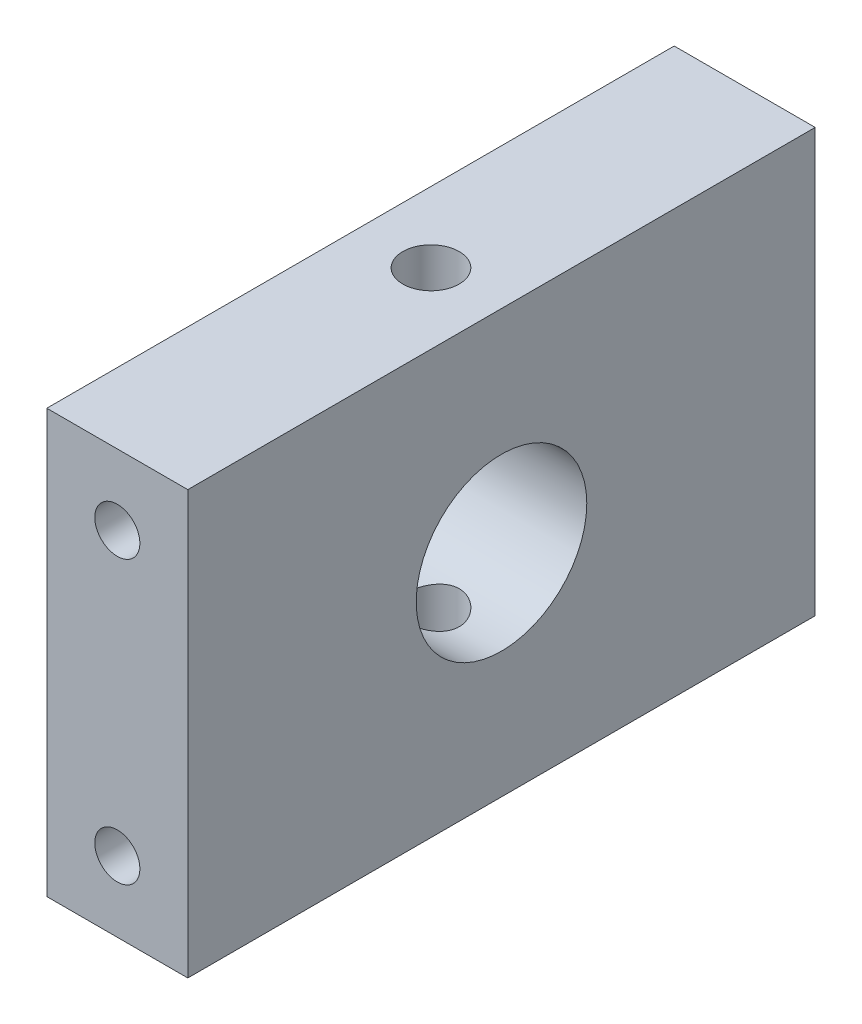
ISO-10303-21;
HEADER;
FILE_DESCRIPTION(('STEP AP214'),'2;1');
FILE_NAME('part.step','',(''),(''),'','','');
FILE_SCHEMA(('AUTOMOTIVE_DESIGN { 1 0 10303 214 1 1 1 1 }'));
ENDSEC;
DATA;
#1=APPLICATION_CONTEXT('core data for automotive mechanical design processes');
#2=APPLICATION_PROTOCOL_DEFINITION('international standard','automotive_design',2000,#1);
#3=PRODUCT_CONTEXT('',#1,'mechanical');
#4=PRODUCT('Part','Part','',(#3));
#5=PRODUCT_RELATED_PRODUCT_CATEGORY('part','',(#4));
#6=PRODUCT_DEFINITION_FORMATION('','',#4);
#7=PRODUCT_DEFINITION_CONTEXT('part definition',#1,'design');
#8=PRODUCT_DEFINITION('design','',#6,#7);
#9=PRODUCT_DEFINITION_SHAPE('','',#8);
#10=(LENGTH_UNIT() NAMED_UNIT(*) SI_UNIT(.MILLI.,.METRE.));
#11=(NAMED_UNIT(*) PLANE_ANGLE_UNIT() SI_UNIT($,.RADIAN.));
#12=(NAMED_UNIT(*) SI_UNIT($,.STERADIAN.) SOLID_ANGLE_UNIT());
#13=UNCERTAINTY_MEASURE_WITH_UNIT(LENGTH_MEASURE(1.E-05),#10,'distance_accuracy_value','');
#14=(GEOMETRIC_REPRESENTATION_CONTEXT(3) GLOBAL_UNCERTAINTY_ASSIGNED_CONTEXT((#13)) GLOBAL_UNIT_ASSIGNED_CONTEXT((#10,
#11,#12)) REPRESENTATION_CONTEXT('',''));
#15=CARTESIAN_POINT('',(0.,0.,0.));
#16=DIRECTION('',(0.,0.,1.));
#17=DIRECTION('',(1.,0.,0.));
#18=AXIS2_PLACEMENT_3D('',#15,#16,#17);
#19=CARTESIAN_POINT('',(10.,0.,0.));
#20=DIRECTION('',(1.,0.,0.));
#21=DIRECTION('',(0.,0.,-1.));
#22=AXIS2_PLACEMENT_3D('',#19,#20,#21);
#23=PLANE('',#22);
#24=DIRECTION('',(0.,1.,0.));
#25=VECTOR('',#24,1.);
#26=CARTESIAN_POINT('',(10.,15.,-22.25));
#27=LINE('',#26,#25);
#28=CARTESIAN_POINT('',(10.,-15.,-22.25));
#29=VERTEX_POINT('',#28);
#30=CARTESIAN_POINT('',(10.,15.,-22.25));
#31=VERTEX_POINT('',#30);
#32=EDGE_CURVE('E94',#29,#31,#27,.T.);
#33=ORIENTED_EDGE('',*,*,#32,.T.);
#34=DIRECTION('',(0.,0.,1.));
#35=VECTOR('',#34,1.);
#36=CARTESIAN_POINT('',(10.,15.,22.25));
#37=LINE('',#36,#35);
#38=CARTESIAN_POINT('',(10.,15.,22.25));
#39=VERTEX_POINT('',#38);
#40=EDGE_CURVE('E89',#31,#39,#37,.T.);
#41=ORIENTED_EDGE('',*,*,#40,.T.);
#42=DIRECTION('',(0.,-1.,0.));
#43=VECTOR('',#42,1.);
#44=CARTESIAN_POINT('',(10.,15.,22.25));
#45=LINE('',#44,#43);
#46=CARTESIAN_POINT('',(10.,-15.,22.25));
#47=VERTEX_POINT('',#46);
#48=EDGE_CURVE('E92',#39,#47,#45,.T.);
#49=ORIENTED_EDGE('',*,*,#48,.T.);
#50=DIRECTION('',(0.,0.,-1.));
#51=VECTOR('',#50,1.);
#52=CARTESIAN_POINT('',(10.,-15.,22.25));
#53=LINE('',#52,#51);
#54=EDGE_CURVE('E59',#47,#29,#53,.T.);
#55=ORIENTED_EDGE('',*,*,#54,.T.);
#56=EDGE_LOOP('',(#33,#41,#49,#55));
#57=FACE_BOUND('',#56,.T.);
#58=CARTESIAN_POINT('',(10.,0.,0.));
#59=DIRECTION('',(1.,0.,0.));
#60=DIRECTION('',(0.,0.,-1.));
#61=AXIS2_PLACEMENT_3D('',#58,#59,#60);
#62=CIRCLE('',#61,6.05);
#63=CARTESIAN_POINT('',(10.,0.,-6.05));
#64=VERTEX_POINT('',#63);
#65=EDGE_CURVE('E110',#64,#64,#62,.T.);
#66=ORIENTED_EDGE('',*,*,#65,.F.);
#67=EDGE_LOOP('',(#66));
#68=FACE_BOUND('',#67,.T.);
#69=ADVANCED_FACE('F35',(#57,#68),#23,.T.);
#70=CARTESIAN_POINT('',(0.,0.,0.));
#71=DIRECTION('',(1.,0.,0.));
#72=DIRECTION('',(0.,0.,-1.));
#73=AXIS2_PLACEMENT_3D('',#70,#71,#72);
#74=PLANE('',#73);
#75=DIRECTION('',(0.,1.,0.));
#76=VECTOR('',#75,1.);
#77=CARTESIAN_POINT('',(0.,15.,-22.25));
#78=LINE('',#77,#76);
#79=CARTESIAN_POINT('',(0.,-15.,-22.25));
#80=VERTEX_POINT('',#79);
#81=CARTESIAN_POINT('',(0.,15.,-22.25));
#82=VERTEX_POINT('',#81);
#83=EDGE_CURVE('E107',#80,#82,#78,.T.);
#84=ORIENTED_EDGE('',*,*,#83,.F.);
#85=DIRECTION('',(0.,0.,-1.));
#86=VECTOR('',#85,1.);
#87=CARTESIAN_POINT('',(0.,-15.,22.25));
#88=LINE('',#87,#86);
#89=CARTESIAN_POINT('',(0.,-15.,22.25));
#90=VERTEX_POINT('',#89);
#91=EDGE_CURVE('E82',#90,#80,#88,.T.);
#92=ORIENTED_EDGE('',*,*,#91,.F.);
#93=DIRECTION('',(0.,-1.,0.));
#94=VECTOR('',#93,1.);
#95=CARTESIAN_POINT('',(0.,15.,22.25));
#96=LINE('',#95,#94);
#97=CARTESIAN_POINT('',(0.,15.,22.25));
#98=VERTEX_POINT('',#97);
#99=EDGE_CURVE('E76',#98,#90,#96,.T.);
#100=ORIENTED_EDGE('',*,*,#99,.F.);
#101=DIRECTION('',(0.,0.,1.));
#102=VECTOR('',#101,1.);
#103=CARTESIAN_POINT('',(0.,15.,22.25));
#104=LINE('',#103,#102);
#105=EDGE_CURVE('E98',#82,#98,#104,.T.);
#106=ORIENTED_EDGE('',*,*,#105,.F.);
#107=EDGE_LOOP('',(#84,#92,#100,#106));
#108=FACE_BOUND('',#107,.T.);
#109=CARTESIAN_POINT('',(0.,0.,0.));
#110=DIRECTION('',(1.,0.,0.));
#111=DIRECTION('',(0.,0.,-1.));
#112=AXIS2_PLACEMENT_3D('',#109,#110,#111);
#113=CIRCLE('',#112,6.05);
#114=CARTESIAN_POINT('',(0.,0.,-6.05));
#115=VERTEX_POINT('',#114);
#116=EDGE_CURVE('E191',#115,#115,#113,.T.);
#117=ORIENTED_EDGE('',*,*,#116,.T.);
#118=EDGE_LOOP('',(#117));
#119=FACE_BOUND('',#118,.T.);
#120=ADVANCED_FACE('F157',(#108,#119),#74,.F.);
#121=CARTESIAN_POINT('',(10.,15.,-22.25));
#122=DIRECTION('',(0.,0.,1.));
#123=DIRECTION('',(0.,-1.,0.));
#124=AXIS2_PLACEMENT_3D('',#121,#122,#123);
#125=PLANE('',#124);
#126=CARTESIAN_POINT('',(5.,10.,-22.25));
#127=DIRECTION('',(0.,0.,1.));
#128=DIRECTION('',(1.,0.,0.));
#129=AXIS2_PLACEMENT_3D('',#126,#127,#128);
#130=CIRCLE('',#129,1.6);
#131=CARTESIAN_POINT('',(6.6,10.,-22.25));
#132=VERTEX_POINT('',#131);
#133=EDGE_CURVE('E184',#132,#132,#130,.T.);
#134=ORIENTED_EDGE('',*,*,#133,.T.);
#135=EDGE_LOOP('',(#134));
#136=FACE_BOUND('',#135,.T.);
#137=CARTESIAN_POINT('',(5.,-10.,-22.25));
#138=DIRECTION('',(0.,0.,1.));
#139=DIRECTION('',(-1.,0.,0.));
#140=AXIS2_PLACEMENT_3D('',#137,#138,#139);
#141=CIRCLE('',#140,1.6);
#142=CARTESIAN_POINT('',(3.4,-10.,-22.25));
#143=VERTEX_POINT('',#142);
#144=EDGE_CURVE('E234',#143,#143,#141,.T.);
#145=ORIENTED_EDGE('',*,*,#144,.T.);
#146=EDGE_LOOP('',(#145));
#147=FACE_BOUND('',#146,.T.);
#148=ORIENTED_EDGE('',*,*,#83,.T.);
#149=DIRECTION('',(-1.,0.,0.));
#150=VECTOR('',#149,1.);
#151=CARTESIAN_POINT('',(10.,15.,-22.25));
#152=LINE('',#151,#150);
#153=EDGE_CURVE('E11',#31,#82,#152,.T.);
#154=ORIENTED_EDGE('',*,*,#153,.F.);
#155=ORIENTED_EDGE('',*,*,#32,.F.);
#156=DIRECTION('',(-1.,0.,0.));
#157=VECTOR('',#156,1.);
#158=CARTESIAN_POINT('',(10.,-15.,-22.25));
#159=LINE('',#158,#157);
#160=EDGE_CURVE('E103',#29,#80,#159,.T.);
#161=ORIENTED_EDGE('',*,*,#160,.T.);
#162=EDGE_LOOP('',(#148,#154,#155,#161));
#163=FACE_BOUND('',#162,.T.);
#164=ADVANCED_FACE('F37',(#136,#147,#163),#125,.F.);
#165=CARTESIAN_POINT('',(10.,15.,22.25));
#166=DIRECTION('',(0.,-1.,0.));
#167=DIRECTION('',(0.,0.,-1.));
#168=AXIS2_PLACEMENT_3D('',#165,#166,#167);
#169=PLANE('',#168);
#170=CARTESIAN_POINT('',(5.,15.,0.));
#171=DIRECTION('',(0.,1.,0.));
#172=DIRECTION('',(0.,0.,1.));
#173=AXIS2_PLACEMENT_3D('',#170,#171,#172);
#174=CIRCLE('',#173,2.);
#175=CARTESIAN_POINT('',(5.,15.,2.));
#176=VERTEX_POINT('',#175);
#177=EDGE_CURVE('E177',#176,#176,#174,.T.);
#178=ORIENTED_EDGE('',*,*,#177,.F.);
#179=EDGE_LOOP('',(#178));
#180=FACE_BOUND('',#179,.T.);
#181=ORIENTED_EDGE('',*,*,#105,.T.);
#182=DIRECTION('',(-1.,0.,0.));
#183=VECTOR('',#182,1.);
#184=CARTESIAN_POINT('',(10.,15.,22.25));
#185=LINE('',#184,#183);
#186=EDGE_CURVE('E50',#39,#98,#185,.T.);
#187=ORIENTED_EDGE('',*,*,#186,.F.);
#188=ORIENTED_EDGE('',*,*,#40,.F.);
#189=ORIENTED_EDGE('',*,*,#153,.T.);
#190=EDGE_LOOP('',(#181,#187,#188,#189));
#191=FACE_BOUND('',#190,.T.);
#192=ADVANCED_FACE('F97',(#180,#191),#169,.F.);
#193=CARTESIAN_POINT('',(10.,15.,22.25));
#194=DIRECTION('',(0.,0.,-1.));
#195=DIRECTION('',(0.,1.,0.));
#196=AXIS2_PLACEMENT_3D('',#193,#194,#195);
#197=PLANE('',#196);
#198=CARTESIAN_POINT('',(5.,10.,22.25));
#199=DIRECTION('',(0.,0.,1.));
#200=DIRECTION('',(1.,0.,0.));
#201=AXIS2_PLACEMENT_3D('',#198,#199,#200);
#202=CIRCLE('',#201,1.6);
#203=CARTESIAN_POINT('',(6.6,10.,22.25));
#204=VERTEX_POINT('',#203);
#205=EDGE_CURVE('E192',#204,#204,#202,.T.);
#206=ORIENTED_EDGE('',*,*,#205,.F.);
#207=EDGE_LOOP('',(#206));
#208=FACE_BOUND('',#207,.T.);
#209=CARTESIAN_POINT('',(5.,-10.,22.25));
#210=DIRECTION('',(0.,0.,1.));
#211=DIRECTION('',(-1.,0.,0.));
#212=AXIS2_PLACEMENT_3D('',#209,#210,#211);
#213=CIRCLE('',#212,1.6);
#214=CARTESIAN_POINT('',(3.4,-10.,22.25));
#215=VERTEX_POINT('',#214);
#216=EDGE_CURVE('E198',#215,#215,#213,.T.);
#217=ORIENTED_EDGE('',*,*,#216,.F.);
#218=EDGE_LOOP('',(#217));
#219=FACE_BOUND('',#218,.T.);
#220=ORIENTED_EDGE('',*,*,#99,.T.);
#221=DIRECTION('',(-1.,0.,0.));
#222=VECTOR('',#221,1.);
#223=CARTESIAN_POINT('',(10.,-15.,22.25));
#224=LINE('',#223,#222);
#225=EDGE_CURVE('E99',#47,#90,#224,.T.);
#226=ORIENTED_EDGE('',*,*,#225,.F.);
#227=ORIENTED_EDGE('',*,*,#48,.F.);
#228=ORIENTED_EDGE('',*,*,#186,.T.);
#229=EDGE_LOOP('',(#220,#226,#227,#228));
#230=FACE_BOUND('',#229,.T.);
#231=ADVANCED_FACE('F101',(#208,#219,#230),#197,.F.);
#232=CARTESIAN_POINT('',(10.,-15.,22.25));
#233=DIRECTION('',(0.,1.,0.));
#234=DIRECTION('',(0.,0.,1.));
#235=AXIS2_PLACEMENT_3D('',#232,#233,#234);
#236=PLANE('',#235);
#237=CARTESIAN_POINT('',(5.,-15.,0.));
#238=DIRECTION('',(0.,1.,0.));
#239=DIRECTION('',(0.,0.,1.));
#240=AXIS2_PLACEMENT_3D('',#237,#238,#239);
#241=CIRCLE('',#240,2.);
#242=CARTESIAN_POINT('',(5.,-15.,2.));
#243=VERTEX_POINT('',#242);
#244=EDGE_CURVE('E120',#243,#243,#241,.T.);
#245=ORIENTED_EDGE('',*,*,#244,.T.);
#246=EDGE_LOOP('',(#245));
#247=FACE_BOUND('',#246,.T.);
#248=ORIENTED_EDGE('',*,*,#91,.T.);
#249=ORIENTED_EDGE('',*,*,#160,.F.);
#250=ORIENTED_EDGE('',*,*,#54,.F.);
#251=ORIENTED_EDGE('',*,*,#225,.T.);
#252=EDGE_LOOP('',(#248,#249,#250,#251));
#253=FACE_BOUND('',#252,.T.);
#254=ADVANCED_FACE('F152',(#247,#253),#236,.F.);
#255=CARTESIAN_POINT('',(10.,0.,0.));
#256=DIRECTION('',(-1.,0.,0.));
#257=DIRECTION('',(0.,0.,1.));
#258=AXIS2_PLACEMENT_3D('',#255,#256,#257);
#259=CYLINDRICAL_SURFACE('',#258,6.05);
#260=CARTESIAN_POINT('',(5.,-5.70985989320229,2.));
#261=CARTESIAN_POINT('',(5.10899341399842,-5.70985969251801,2.00000033299551));
#262=CARTESIAN_POINT('',(5.21798517746904,-5.71301480876261,1.99106018764557));
#263=CARTESIAN_POINT('',(5.43274335025564,-5.72523014456364,1.95565393739282));
#264=CARTESIAN_POINT('',(5.53850918025653,-5.73429141829144,1.92918470376499));
#265=CARTESIAN_POINT('',(5.74367022766111,-5.75718298945268,1.85974865410086));
#266=CARTESIAN_POINT('',(5.84307733276571,-5.77100405988683,1.81681373909219));
#267=CARTESIAN_POINT('',(6.03330909579794,-5.80184459654205,1.71577369415444));
#268=CARTESIAN_POINT('',(6.12413190342937,-5.81886474995513,1.65766530377944));
#269=CARTESIAN_POINT('',(6.29811144742764,-5.85492013777094,1.52553295358191));
#270=CARTESIAN_POINT('',(6.38088968236369,-5.87400498740321,1.45102403554484));
#271=CARTESIAN_POINT('',(6.53303335790895,-5.91161962401294,1.28924100931994));
#272=CARTESIAN_POINT('',(6.60239668429235,-5.93014932310891,1.20196489278789));
#273=CARTESIAN_POINT('',(6.72745258924378,-5.96513938377732,1.01436352312949));
#274=CARTESIAN_POINT('',(6.78274950256297,-5.98153458529986,0.913761291745258));
#275=CARTESIAN_POINT('',(6.87548664755569,-6.00982445939949,0.704048423552746));
#276=CARTESIAN_POINT('',(6.91293160752153,-6.02172032350444,0.594940048611088));
#277=CARTESIAN_POINT('',(6.96762105046736,-6.03931977537713,0.375279847223151));
#278=CARTESIAN_POINT('',(6.98551373545209,-6.04522157358489,0.264905581909314));
#279=CARTESIAN_POINT('',(7.00265078238568,-6.0508710279118,0.042574144601172));
#280=CARTESIAN_POINT('',(7.00189987363358,-6.05062024474939,-0.0693826187609113));
#281=CARTESIAN_POINT('',(6.98218425956514,-6.04412760933234,-0.28711644888507));
#282=CARTESIAN_POINT('',(6.9639234236705,-6.03811728667631,-0.392965281514513));
#283=CARTESIAN_POINT('',(6.91086907465745,-6.02107078328729,-0.60000153330326));
#284=CARTESIAN_POINT('',(6.8760744459458,-6.01003426342116,-0.70118863741388));
#285=CARTESIAN_POINT('',(6.79052371378497,-5.98387844045024,-0.897579620221879));
#286=CARTESIAN_POINT('',(6.73956552572136,-5.96870780892522,-0.992688349802697));
#287=CARTESIAN_POINT('',(6.62330013260558,-5.93586549044274,-1.17321436451504));
#288=CARTESIAN_POINT('',(6.55798898419064,-5.91819311662703,-1.25862897646524));
#289=CARTESIAN_POINT('',(6.4113155686395,-5.88124585221435,-1.42153052077404));
#290=CARTESIAN_POINT('',(6.32934960760291,-5.86193465104437,-1.49846645322394));
#291=CARTESIAN_POINT('',(6.15351235331923,-5.8245790943231,-1.63767711547325));
#292=CARTESIAN_POINT('',(6.05963929081569,-5.80653492765866,-1.6999496625287));
#293=CARTESIAN_POINT('',(5.86093226336053,-5.773559796802,-1.80881182241094));
#294=CARTESIAN_POINT('',(5.75596476624013,-5.75867529539656,-1.85517284190742));
#295=CARTESIAN_POINT('',(5.53909783510901,-5.7342437035458,-1.92937638731519));
#296=CARTESIAN_POINT('',(5.42720126978115,-5.72469442047782,-1.95722652156643));
#297=CARTESIAN_POINT('',(5.20498195250766,-5.71250935220619,-1.99250389574057));
#298=CARTESIAN_POINT('',(5.09481038116964,-5.70958509251573,-2.00078401645862));
#299=CARTESIAN_POINT('',(4.87463603435479,-5.71017556693195,-1.99909929185839));
#300=CARTESIAN_POINT('',(4.76463323234498,-5.71368915608358,-1.98913769078416));
#301=CARTESIAN_POINT('',(4.55177035461893,-5.72647222201891,-1.95201810779321));
#302=CARTESIAN_POINT('',(4.44879447002954,-5.73554438328614,-1.92544902439455));
#303=CARTESIAN_POINT('',(4.2487818678694,-5.7582064146367,-1.85657326615113));
#304=CARTESIAN_POINT('',(4.15174619565446,-5.77179707719296,-1.81426383054508));
#305=CARTESIAN_POINT('',(3.96300113329352,-5.80249204215639,-1.71360143681955));
#306=CARTESIAN_POINT('',(3.87155373989132,-5.81969305804854,-1.65478750904736));
#307=CARTESIAN_POINT('',(3.69951744678699,-5.85548125210023,-1.52331016463989));
#308=CARTESIAN_POINT('',(3.61893170877639,-5.87406883143557,-1.45064273022087));
#309=CARTESIAN_POINT('',(3.46697654698883,-5.91159696948547,-1.28944758923434));
#310=CARTESIAN_POINT('',(3.39622155768305,-5.93051278764597,-1.20033322685701));
#311=CARTESIAN_POINT('',(3.2706322294915,-5.96569936907317,-1.01103203565401));
#312=CARTESIAN_POINT('',(3.21579729861546,-5.98197023068315,-0.910845618736017));
#313=CARTESIAN_POINT('',(3.12411073659708,-6.0099551027351,-0.702761356127097));
#314=CARTESIAN_POINT('',(3.08713983047127,-6.02169922770379,-0.594920330359575));
#315=CARTESIAN_POINT('',(3.03200676202594,-6.0394376664633,-0.374087841434169));
#316=CARTESIAN_POINT('',(3.01383793445255,-6.0454340177589,-0.261098218271073));
#317=CARTESIAN_POINT('',(2.99741689060039,-6.05085002054111,-0.038800693974466));
#318=CARTESIAN_POINT('',(2.99828190169292,-6.05056118082891,0.0704356116031505));
#319=CARTESIAN_POINT('',(3.01773217932709,-6.04415435128964,0.287134238493143));
#320=CARTESIAN_POINT('',(3.03631604799262,-6.03803682129963,0.394596699067337));
#321=CARTESIAN_POINT('',(3.09009386698772,-6.02076493345114,0.603051770413247));
#322=CARTESIAN_POINT('',(3.12502752636179,-6.00968962044206,0.704118547319735));
#323=CARTESIAN_POINT('',(3.21027316721122,-5.98364273590794,0.898996855735392));
#324=CARTESIAN_POINT('',(3.26058791443562,-5.96867046372351,0.992807078603384));
#325=CARTESIAN_POINT('',(3.3772866408274,-5.93569360604619,1.17424795836106));
#326=CARTESIAN_POINT('',(3.44419090035137,-5.91759816511273,1.26152725662341));
#327=CARTESIAN_POINT('',(3.59128009706524,-5.88064035645428,1.42390898291508));
#328=CARTESIAN_POINT('',(3.67146923598886,-5.86177774751851,1.49900754350853));
#329=CARTESIAN_POINT('',(3.84652712503139,-5.82455327349567,1.63781812474931));
#330=CARTESIAN_POINT('',(3.94184062080506,-5.80623828937058,1.70098358803412));
#331=CARTESIAN_POINT('',(4.14229789842128,-5.7730762503732,1.81035159838277));
#332=CARTESIAN_POINT('',(4.24743890239785,-5.75822821965004,1.85655892078996));
#333=CARTESIAN_POINT('',(4.45913841123146,-5.73450476013008,1.92855555944112));
#334=CARTESIAN_POINT('',(4.56535529609648,-5.7253648762804,1.95526062697073));
#335=CARTESIAN_POINT('',(4.78104940146791,-5.71304352731335,1.99097975927799));
#336=CARTESIAN_POINT('',(4.89052553329869,-5.7098600947723,1.99999966553477));
#337=CARTESIAN_POINT('',(5.,-5.70985989320229,2.));
#338=B_SPLINE_CURVE_WITH_KNOTS('',3,(#260,#261,#262,#263,#264,#265,#266,#267,#268,#269,#270,
#271,#272,#273,#274,#275,#276,#277,#278,#279,#280,#281,#282,#283,#284,#285,#286,#287,#288,#289,
#290,#291,#292,#293,#294,#295,#296,#297,#298,#299,#300,#301,#302,#303,#304,#305,#306,#307,#308,
#309,#310,#311,#312,#313,#314,#315,#316,#317,#318,#319,#320,#321,#322,#323,#324,#325,#326,#327,
#328,#329,#330,#331,#332,#333,#334,#335,#336,#337),.UNSPECIFIED.,.T.,.F.,(4,2,2,2,2,2,2,2,2,2,2,
2,2,2,2,2,2,2,2,2,2,2,2,2,2,2,2,2,2,2,2,2,2,2,2,2,2,2,4),(0.,0.326574975403818,
0.653208256109472,0.979211880376894,1.30528561337574,1.64274705864243,1.98026164548094,
2.32642123358634,2.67248908639312,3.00669899443492,3.34082412469937,3.66205754651695,
3.98331264616303,4.30875399982854,4.63428487797235,4.97490521811375,5.31557622988557,
5.66095456331037,6.006190851479,6.33607928009364,6.66590904458422,6.98465922673364,
7.3034653420889,7.63225621853754,7.96114259613564,8.30555030542559,8.64994520621116,
8.99200772875855,9.33394895006961,9.66006613394021,9.9861575919026,10.3072255647476,
10.6283513043963,10.9612184797554,11.2941911358412,11.6399223084693,11.9855560497719,
12.3136807937811,12.6416971386113),.UNSPECIFIED.);
#339=CARTESIAN_POINT('',(5.,-5.70985989320229,2.));
#340=VERTEX_POINT('',#339);
#341=EDGE_CURVE('E39',#340,#340,#338,.T.);
#342=ORIENTED_EDGE('',*,*,#341,.F.);
#343=EDGE_LOOP('',(#342));
#344=FACE_BOUND('',#343,.T.);
#345=CARTESIAN_POINT('',(5.,5.70985989320229,2.));
#346=CARTESIAN_POINT('',(4.89100658600158,5.70985969251801,2.00000033299551));
#347=CARTESIAN_POINT('',(4.78201482253096,5.71301480876261,1.99106018764557));
#348=CARTESIAN_POINT('',(4.56725664974436,5.72523014456364,1.95565393739282));
#349=CARTESIAN_POINT('',(4.46149081974347,5.73429141829144,1.92918470376499));
#350=CARTESIAN_POINT('',(4.25632977233889,5.75718298945268,1.85974865410086));
#351=CARTESIAN_POINT('',(4.15692266723429,5.77100405988683,1.81681373909219));
#352=CARTESIAN_POINT('',(3.96669090420206,5.80184459654205,1.71577369415444));
#353=CARTESIAN_POINT('',(3.87586809657063,5.81886474995513,1.65766530377944));
#354=CARTESIAN_POINT('',(3.70188855257237,5.85492013777093,1.52553295358191));
#355=CARTESIAN_POINT('',(3.61911031763631,5.87400498740321,1.45102403554484));
#356=CARTESIAN_POINT('',(3.46696664209105,5.91161962401294,1.28924100931994));
#357=CARTESIAN_POINT('',(3.39760331570766,5.93014932310891,1.20196489278789));
#358=CARTESIAN_POINT('',(3.27254741075622,5.96513938377732,1.01436352312949));
#359=CARTESIAN_POINT('',(3.21725049743703,5.98153458529986,0.913761291745257));
#360=CARTESIAN_POINT('',(3.1245133524443,6.00982445939949,0.704048423552745));
#361=CARTESIAN_POINT('',(3.08706839247847,6.02172032350444,0.594940048611087));
#362=CARTESIAN_POINT('',(3.03237894953263,6.03931977537713,0.37527984722315));
#363=CARTESIAN_POINT('',(3.01448626454791,6.04522157358489,0.264905581909314));
#364=CARTESIAN_POINT('',(2.99734921761432,6.0508710279118,0.0425741446011714));
#365=CARTESIAN_POINT('',(2.99810012636643,6.05062024474939,-0.069382618760912));
#366=CARTESIAN_POINT('',(3.01781574043486,6.04412760933234,-0.28711644888507));
#367=CARTESIAN_POINT('',(3.0360765763295,6.03811728667631,-0.392965281514514));
#368=CARTESIAN_POINT('',(3.08913092534256,6.02107078328729,-0.60000153330326));
#369=CARTESIAN_POINT('',(3.1239255540542,6.01003426342116,-0.70118863741388));
#370=CARTESIAN_POINT('',(3.20947628621504,5.98387844045024,-0.89757962022188));
#371=CARTESIAN_POINT('',(3.26043447427864,5.96870780892522,-0.992688349802697));
#372=CARTESIAN_POINT('',(3.37669986739442,5.93586549044274,-1.17321436451504));
#373=CARTESIAN_POINT('',(3.44201101580936,5.91819311662703,-1.25862897646524));
#374=CARTESIAN_POINT('',(3.5886844313605,5.88124585221435,-1.42153052077404));
#375=CARTESIAN_POINT('',(3.67065039239709,5.86193465104437,-1.49846645322394));
#376=CARTESIAN_POINT('',(3.84648764668078,5.8245790943231,-1.63767711547325));
#377=CARTESIAN_POINT('',(3.94036070918431,5.80653492765866,-1.6999496625287));
#378=CARTESIAN_POINT('',(4.13906773663947,5.773559796802,-1.80881182241094));
#379=CARTESIAN_POINT('',(4.24403523375987,5.75867529539656,-1.85517284190742));
#380=CARTESIAN_POINT('',(4.46090216489099,5.7342437035458,-1.92937638731519));
#381=CARTESIAN_POINT('',(4.57279873021885,5.72469442047782,-1.95722652156643));
#382=CARTESIAN_POINT('',(4.79501804749234,5.71250935220619,-1.99250389574057));
#383=CARTESIAN_POINT('',(4.90518961883036,5.70958509251573,-2.00078401645862));
#384=CARTESIAN_POINT('',(5.12536396564521,5.71017556693195,-1.99909929185839));
#385=CARTESIAN_POINT('',(5.23536676765502,5.71368915608358,-1.98913769078416));
#386=CARTESIAN_POINT('',(5.44822964538107,5.72647222201891,-1.95201810779321));
#387=CARTESIAN_POINT('',(5.55120552997046,5.73554438328614,-1.92544902439455));
#388=CARTESIAN_POINT('',(5.7512181321306,5.7582064146367,-1.85657326615113));
#389=CARTESIAN_POINT('',(5.84825380434554,5.77179707719296,-1.81426383054508));
#390=CARTESIAN_POINT('',(6.03699886670648,5.80249204215639,-1.71360143681955));
#391=CARTESIAN_POINT('',(6.12844626010868,5.81969305804854,-1.65478750904736));
#392=CARTESIAN_POINT('',(6.30048255321301,5.85548125210023,-1.52331016463989));
#393=CARTESIAN_POINT('',(6.38106829122361,5.87406883143557,-1.45064273022087));
#394=CARTESIAN_POINT('',(6.53302345301117,5.91159696948547,-1.28944758923434));
#395=CARTESIAN_POINT('',(6.60377844231696,5.93051278764597,-1.20033322685701));
#396=CARTESIAN_POINT('',(6.7293677705085,5.96569936907317,-1.01103203565401));
#397=CARTESIAN_POINT('',(6.78420270138454,5.98197023068315,-0.910845618736016));
#398=CARTESIAN_POINT('',(6.87588926340292,6.0099551027351,-0.702761356127097));
#399=CARTESIAN_POINT('',(6.91286016952873,6.02169922770379,-0.594920330359574));
#400=CARTESIAN_POINT('',(6.96799323797406,6.0394376664633,-0.374087841434168));
#401=CARTESIAN_POINT('',(6.98616206554745,6.0454340177589,-0.261098218271072));
#402=CARTESIAN_POINT('',(7.00258310939961,6.05085002054111,-0.0388006939744662));
#403=CARTESIAN_POINT('',(7.00171809830708,6.05056118082891,0.0704356116031501));
#404=CARTESIAN_POINT('',(6.98226782067291,6.04415435128964,0.287134238493142));
#405=CARTESIAN_POINT('',(6.96368395200738,6.03803682129963,0.394596699067337));
#406=CARTESIAN_POINT('',(6.90990613301228,6.02076493345114,0.603051770413246));
#407=CARTESIAN_POINT('',(6.87497247363821,6.00968962044206,0.704118547319735));
#408=CARTESIAN_POINT('',(6.78972683278878,5.98364273590794,0.898996855735391));
#409=CARTESIAN_POINT('',(6.73941208556438,5.96867046372351,0.992807078603384));
#410=CARTESIAN_POINT('',(6.6227133591726,5.93569360604619,1.17424795836106));
#411=CARTESIAN_POINT('',(6.55580909964863,5.91759816511273,1.26152725662341));
#412=CARTESIAN_POINT('',(6.40871990293476,5.88064035645428,1.42390898291508));
#413=CARTESIAN_POINT('',(6.32853076401114,5.86177774751851,1.49900754350853));
#414=CARTESIAN_POINT('',(6.15347287496861,5.82455327349567,1.63781812474931));
#415=CARTESIAN_POINT('',(6.05815937919494,5.80623828937058,1.70098358803412));
#416=CARTESIAN_POINT('',(5.85770210157872,5.7730762503732,1.81035159838277));
#417=CARTESIAN_POINT('',(5.75256109760215,5.75822821965004,1.85655892078996));
#418=CARTESIAN_POINT('',(5.54086158876854,5.73450476013008,1.92855555944112));
#419=CARTESIAN_POINT('',(5.43464470390352,5.7253648762804,1.95526062697073));
#420=CARTESIAN_POINT('',(5.21895059853209,5.71304352731335,1.99097975927799));
#421=CARTESIAN_POINT('',(5.10947446670131,5.7098600947723,1.99999966553477));
#422=CARTESIAN_POINT('',(5.,5.70985989320229,2.));
#423=B_SPLINE_CURVE_WITH_KNOTS('',3,(#345,#346,#347,#348,#349,#350,#351,#352,#353,#354,#355,
#356,#357,#358,#359,#360,#361,#362,#363,#364,#365,#366,#367,#368,#369,#370,#371,#372,#373,#374,
#375,#376,#377,#378,#379,#380,#381,#382,#383,#384,#385,#386,#387,#388,#389,#390,#391,#392,#393,
#394,#395,#396,#397,#398,#399,#400,#401,#402,#403,#404,#405,#406,#407,#408,#409,#410,#411,#412,
#413,#414,#415,#416,#417,#418,#419,#420,#421,#422),.UNSPECIFIED.,.T.,.F.,(4,2,2,2,2,2,2,2,2,2,2,
2,2,2,2,2,2,2,2,2,2,2,2,2,2,2,2,2,2,2,2,2,2,2,2,2,2,2,4),(0.,0.326574975403817,
0.653208256109472,0.979211880376893,1.30528561337574,1.64274705864243,1.98026164548094,
2.32642123358634,2.67248908639313,3.00669899443492,3.34082412469937,3.66205754651695,
3.98331264616303,4.30875399982854,4.63428487797235,4.97490521811376,5.31557622988557,
5.66095456331037,6.006190851479,6.33607928009364,6.66590904458422,6.98465922673364,
7.3034653420889,7.63225621853754,7.96114259613564,8.30555030542559,8.64994520621116,
8.99200772875856,9.33394895006961,9.66006613394021,9.98615759190261,10.3072255647476,
10.6283513043963,10.9612184797554,11.2941911358412,11.6399223084693,11.9855560497719,
12.3136807937811,12.6416971386113),.UNSPECIFIED.);
#424=CARTESIAN_POINT('',(5.,5.70985989320229,2.));
#425=VERTEX_POINT('',#424);
#426=EDGE_CURVE('E115',#425,#425,#423,.T.);
#427=ORIENTED_EDGE('',*,*,#426,.F.);
#428=EDGE_LOOP('',(#427));
#429=FACE_BOUND('',#428,.T.);
#430=ORIENTED_EDGE('',*,*,#65,.T.);
#431=EDGE_LOOP('',(#430));
#432=FACE_BOUND('',#431,.T.);
#433=ORIENTED_EDGE('',*,*,#116,.F.);
#434=EDGE_LOOP('',(#433));
#435=FACE_BOUND('',#434,.T.);
#436=ADVANCED_FACE('F121',(#344,#429,#432,#435),#259,.F.);
#437=CARTESIAN_POINT('',(5.,-10.,12.25));
#438=DIRECTION('',(0.,0.,1.));
#439=DIRECTION('',(1.,0.,0.));
#440=AXIS2_PLACEMENT_3D('',#437,#438,#439);
#441=CYLINDRICAL_SURFACE('',#440,1.6);
#442=CARTESIAN_POINT('',(5.,-10.,12.25));
#443=DIRECTION('',(0.,0.,1.));
#444=DIRECTION('',(-1.,0.,0.));
#445=AXIS2_PLACEMENT_3D('',#442,#443,#444);
#446=CIRCLE('',#445,1.6);
#447=CARTESIAN_POINT('',(3.4,-10.,12.25));
#448=VERTEX_POINT('',#447);
#449=EDGE_CURVE('E195',#448,#448,#446,.T.);
#450=ORIENTED_EDGE('',*,*,#449,.F.);
#451=EDGE_LOOP('',(#450));
#452=FACE_BOUND('',#451,.T.);
#453=ORIENTED_EDGE('',*,*,#216,.T.);
#454=EDGE_LOOP('',(#453));
#455=FACE_BOUND('',#454,.T.);
#456=ADVANCED_FACE('F145',(#452,#455),#441,.F.);
#457=CARTESIAN_POINT('',(5.,-10.,12.25));
#458=DIRECTION('',(0.,0.,-1.));
#459=DIRECTION('',(-1.,0.,0.));
#460=AXIS2_PLACEMENT_3D('',#457,#458,#459);
#461=PLANE('',#460);
#462=ORIENTED_EDGE('',*,*,#449,.T.);
#463=EDGE_LOOP('',(#462));
#464=FACE_BOUND('',#463,.T.);
#465=ADVANCED_FACE('F142',(#464),#461,.F.);
#466=CARTESIAN_POINT('',(5.,10.,12.25));
#467=DIRECTION('',(0.,0.,1.));
#468=DIRECTION('',(1.,0.,0.));
#469=AXIS2_PLACEMENT_3D('',#466,#467,#468);
#470=CYLINDRICAL_SURFACE('',#469,1.6);
#471=CARTESIAN_POINT('',(5.,10.,12.25));
#472=DIRECTION('',(0.,0.,1.));
#473=DIRECTION('',(1.,0.,0.));
#474=AXIS2_PLACEMENT_3D('',#471,#472,#473);
#475=CIRCLE('',#474,1.6);
#476=CARTESIAN_POINT('',(6.6,10.,12.25));
#477=VERTEX_POINT('',#476);
#478=EDGE_CURVE('E188',#477,#477,#475,.T.);
#479=ORIENTED_EDGE('',*,*,#478,.F.);
#480=EDGE_LOOP('',(#479));
#481=FACE_BOUND('',#480,.T.);
#482=ORIENTED_EDGE('',*,*,#205,.T.);
#483=EDGE_LOOP('',(#482));
#484=FACE_BOUND('',#483,.T.);
#485=ADVANCED_FACE('F138',(#481,#484),#470,.F.);
#486=CARTESIAN_POINT('',(5.,10.,12.25));
#487=DIRECTION('',(0.,0.,1.));
#488=DIRECTION('',(1.,0.,0.));
#489=AXIS2_PLACEMENT_3D('',#486,#487,#488);
#490=PLANE('',#489);
#491=ORIENTED_EDGE('',*,*,#478,.T.);
#492=EDGE_LOOP('',(#491));
#493=FACE_BOUND('',#492,.T.);
#494=ADVANCED_FACE('F131',(#493),#490,.T.);
#495=CARTESIAN_POINT('',(5.,-15.,0.));
#496=DIRECTION('',(0.,1.,0.));
#497=DIRECTION('',(0.,0.,1.));
#498=AXIS2_PLACEMENT_3D('',#495,#496,#497);
#499=CYLINDRICAL_SURFACE('',#498,2.);
#500=ORIENTED_EDGE('',*,*,#426,.T.);
#501=EDGE_LOOP('',(#500));
#502=FACE_BOUND('',#501,.T.);
#503=ORIENTED_EDGE('',*,*,#177,.T.);
#504=EDGE_LOOP('',(#503));
#505=FACE_BOUND('',#504,.T.);
#506=ADVANCED_FACE('F125',(#502,#505),#499,.F.);
#507=ORIENTED_EDGE('',*,*,#341,.T.);
#508=EDGE_LOOP('',(#507));
#509=FACE_BOUND('',#508,.T.);
#510=ORIENTED_EDGE('',*,*,#244,.F.);
#511=EDGE_LOOP('',(#510));
#512=FACE_BOUND('',#511,.T.);
#513=ADVANCED_FACE('F130',(#509,#512),#499,.F.);
#514=CARTESIAN_POINT('',(5.,-10.,-12.25));
#515=DIRECTION('',(0.,0.,-1.));
#516=DIRECTION('',(-1.,0.,0.));
#517=AXIS2_PLACEMENT_3D('',#514,#515,#516);
#518=CYLINDRICAL_SURFACE('',#517,1.6);
#519=CARTESIAN_POINT('',(5.,-10.,-12.25));
#520=DIRECTION('',(0.,0.,1.));
#521=DIRECTION('',(-1.,0.,0.));
#522=AXIS2_PLACEMENT_3D('',#519,#520,#521);
#523=CIRCLE('',#522,1.6);
#524=CARTESIAN_POINT('',(3.4,-10.,-12.25));
#525=VERTEX_POINT('',#524);
#526=EDGE_CURVE('E231',#525,#525,#523,.T.);
#527=ORIENTED_EDGE('',*,*,#526,.T.);
#528=EDGE_LOOP('',(#527));
#529=FACE_BOUND('',#528,.T.);
#530=ORIENTED_EDGE('',*,*,#144,.F.);
#531=EDGE_LOOP('',(#530));
#532=FACE_BOUND('',#531,.T.);
#533=ADVANCED_FACE('F133',(#529,#532),#518,.F.);
#534=CARTESIAN_POINT('',(5.,-10.,-12.25));
#535=DIRECTION('',(0.,0.,1.));
#536=DIRECTION('',(-1.,0.,0.));
#537=AXIS2_PLACEMENT_3D('',#534,#535,#536);
#538=PLANE('',#537);
#539=ORIENTED_EDGE('',*,*,#526,.F.);
#540=EDGE_LOOP('',(#539));
#541=FACE_BOUND('',#540,.T.);
#542=ADVANCED_FACE('F221',(#541),#538,.F.);
#543=CARTESIAN_POINT('',(5.,10.,-12.25));
#544=DIRECTION('',(0.,0.,-1.));
#545=DIRECTION('',(-1.,0.,0.));
#546=AXIS2_PLACEMENT_3D('',#543,#544,#545);
#547=CYLINDRICAL_SURFACE('',#546,1.6);
#548=CARTESIAN_POINT('',(5.,10.,-12.25));
#549=DIRECTION('',(0.,0.,1.));
#550=DIRECTION('',(1.,0.,0.));
#551=AXIS2_PLACEMENT_3D('',#548,#549,#550);
#552=CIRCLE('',#551,1.6);
#553=CARTESIAN_POINT('',(6.6,10.,-12.25));
#554=VERTEX_POINT('',#553);
#555=EDGE_CURVE('E179',#554,#554,#552,.T.);
#556=ORIENTED_EDGE('',*,*,#555,.T.);
#557=EDGE_LOOP('',(#556));
#558=FACE_BOUND('',#557,.T.);
#559=ORIENTED_EDGE('',*,*,#133,.F.);
#560=EDGE_LOOP('',(#559));
#561=FACE_BOUND('',#560,.T.);
#562=ADVANCED_FACE('F226',(#558,#561),#547,.F.);
#563=CARTESIAN_POINT('',(5.,10.,-12.25));
#564=DIRECTION('',(0.,0.,-1.));
#565=DIRECTION('',(1.,0.,0.));
#566=AXIS2_PLACEMENT_3D('',#563,#564,#565);
#567=PLANE('',#566);
#568=ORIENTED_EDGE('',*,*,#555,.F.);
#569=EDGE_LOOP('',(#568));
#570=FACE_BOUND('',#569,.T.);
#571=ADVANCED_FACE('F242',(#570),#567,.T.);
#572=CLOSED_SHELL('',(#69,#120,#164,#192,#231,#254,#436,#456,#465,#485,#494,#506,#513,#533,#542,
#562,#571));
#573=MANIFOLD_SOLID_BREP('B2',#572);
#574=ADVANCED_BREP_SHAPE_REPRESENTATION('',(#18,#573),#14);
#575=SHAPE_DEFINITION_REPRESENTATION(#9,#574);
ENDSEC;
END-ISO-10303-21;
